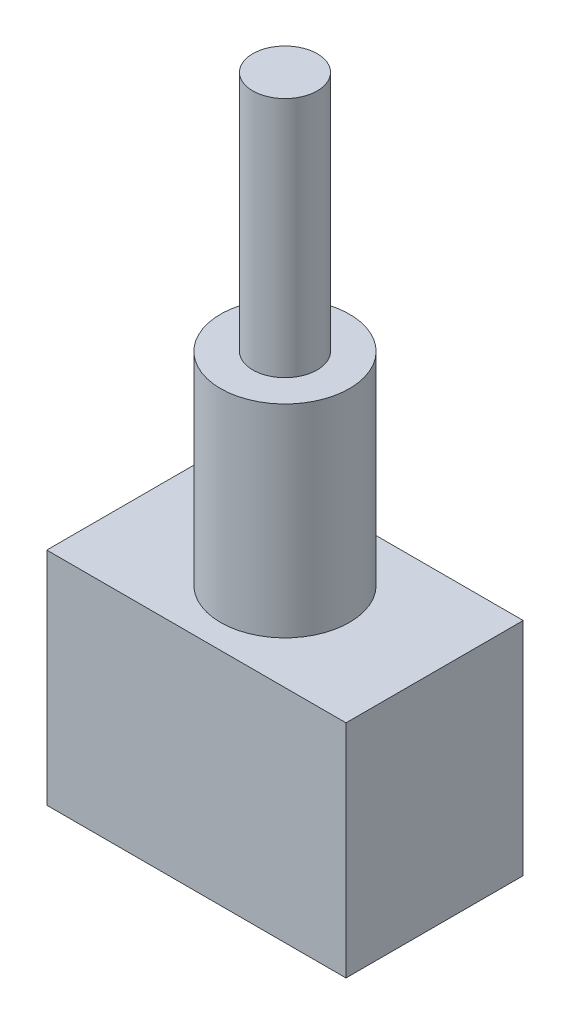
ISO-10303-21;
HEADER;
FILE_DESCRIPTION(('STEP AP214'),'2;1');
FILE_NAME('part.step','',(''),(''),'','','');
FILE_SCHEMA(('AUTOMOTIVE_DESIGN { 1 0 10303 214 1 1 1 1 }'));
ENDSEC;
DATA;
#1=APPLICATION_CONTEXT('core data for automotive mechanical design processes');
#2=APPLICATION_PROTOCOL_DEFINITION('international standard','automotive_design',2000,#1);
#3=PRODUCT_CONTEXT('',#1,'mechanical');
#4=PRODUCT('Part','Part','',(#3));
#5=PRODUCT_RELATED_PRODUCT_CATEGORY('part','',(#4));
#6=PRODUCT_DEFINITION_FORMATION('','',#4);
#7=PRODUCT_DEFINITION_CONTEXT('part definition',#1,'design');
#8=PRODUCT_DEFINITION('design','',#6,#7);
#9=PRODUCT_DEFINITION_SHAPE('','',#8);
#10=(LENGTH_UNIT() NAMED_UNIT(*) SI_UNIT(.MILLI.,.METRE.));
#11=(NAMED_UNIT(*) PLANE_ANGLE_UNIT() SI_UNIT($,.RADIAN.));
#12=(NAMED_UNIT(*) SI_UNIT($,.STERADIAN.) SOLID_ANGLE_UNIT());
#13=UNCERTAINTY_MEASURE_WITH_UNIT(LENGTH_MEASURE(1.E-05),#10,'distance_accuracy_value','');
#14=(GEOMETRIC_REPRESENTATION_CONTEXT(3) GLOBAL_UNCERTAINTY_ASSIGNED_CONTEXT((#13)) GLOBAL_UNIT_ASSIGNED_CONTEXT((#10,
#11,#12)) REPRESENTATION_CONTEXT('',''));
#15=CARTESIAN_POINT('',(0.,0.,0.));
#16=DIRECTION('',(0.,0.,1.));
#17=DIRECTION('',(1.,0.,0.));
#18=AXIS2_PLACEMENT_3D('',#15,#16,#17);
#19=CARTESIAN_POINT('',(0.,0.,7.7));
#20=DIRECTION('',(1.,0.,0.));
#21=DIRECTION('',(0.,0.,-1.));
#22=AXIS2_PLACEMENT_3D('',#19,#20,#21);
#23=PLANE('',#22);
#24=DIRECTION('',(0.,-1.,0.));
#25=VECTOR('',#24,1.);
#26=CARTESIAN_POINT('',(0.,0.,0.));
#27=LINE('',#26,#25);
#28=CARTESIAN_POINT('',(0.,9.6,0.));
#29=VERTEX_POINT('',#28);
#30=CARTESIAN_POINT('',(0.,0.,0.));
#31=VERTEX_POINT('',#30);
#32=EDGE_CURVE('E101',#29,#31,#27,.T.);
#33=ORIENTED_EDGE('',*,*,#32,.T.);
#34=DIRECTION('',(0.,0.,-1.));
#35=VECTOR('',#34,1.);
#36=CARTESIAN_POINT('',(0.,0.,7.7));
#37=LINE('',#36,#35);
#38=CARTESIAN_POINT('',(0.,0.,7.7));
#39=VERTEX_POINT('',#38);
#40=EDGE_CURVE('E37',#39,#31,#37,.T.);
#41=ORIENTED_EDGE('',*,*,#40,.F.);
#42=DIRECTION('',(0.,-1.,0.));
#43=VECTOR('',#42,1.);
#44=CARTESIAN_POINT('',(0.,0.,7.7));
#45=LINE('',#44,#43);
#46=CARTESIAN_POINT('',(0.,9.6,7.7));
#47=VERTEX_POINT('',#46);
#48=EDGE_CURVE('E88',#47,#39,#45,.T.);
#49=ORIENTED_EDGE('',*,*,#48,.F.);
#50=DIRECTION('',(0.,0.,-1.));
#51=VECTOR('',#50,1.);
#52=CARTESIAN_POINT('',(0.,9.6,7.7));
#53=LINE('',#52,#51);
#54=EDGE_CURVE('E97',#47,#29,#53,.T.);
#55=ORIENTED_EDGE('',*,*,#54,.T.);
#56=EDGE_LOOP('',(#33,#41,#49,#55));
#57=FACE_BOUND('',#56,.T.);
#58=ADVANCED_FACE('F34',(#57),#23,.F.);
#59=CARTESIAN_POINT('',(13.,0.,7.7));
#60=DIRECTION('',(0.,1.,0.));
#61=DIRECTION('',(-1.,0.,0.));
#62=AXIS2_PLACEMENT_3D('',#59,#60,#61);
#63=PLANE('',#62);
#64=DIRECTION('',(1.,0.,0.));
#65=VECTOR('',#64,1.);
#66=CARTESIAN_POINT('',(13.,0.,0.));
#67=LINE('',#66,#65);
#68=CARTESIAN_POINT('',(13.,0.,0.));
#69=VERTEX_POINT('',#68);
#70=EDGE_CURVE('E93',#31,#69,#67,.T.);
#71=ORIENTED_EDGE('',*,*,#70,.T.);
#72=DIRECTION('',(0.,0.,-1.));
#73=VECTOR('',#72,1.);
#74=CARTESIAN_POINT('',(13.,0.,7.7));
#75=LINE('',#74,#73);
#76=CARTESIAN_POINT('',(13.,0.,7.7));
#77=VERTEX_POINT('',#76);
#78=EDGE_CURVE('E91',#77,#69,#75,.T.);
#79=ORIENTED_EDGE('',*,*,#78,.F.);
#80=DIRECTION('',(1.,0.,0.));
#81=VECTOR('',#80,1.);
#82=CARTESIAN_POINT('',(13.,0.,7.7));
#83=LINE('',#82,#81);
#84=EDGE_CURVE('E83',#39,#77,#83,.T.);
#85=ORIENTED_EDGE('',*,*,#84,.F.);
#86=ORIENTED_EDGE('',*,*,#40,.T.);
#87=EDGE_LOOP('',(#71,#79,#85,#86));
#88=FACE_BOUND('',#87,.T.);
#89=ADVANCED_FACE('F92',(#88),#63,.F.);
#90=CARTESIAN_POINT('',(13.,9.6,7.7));
#91=DIRECTION('',(-1.,0.,0.));
#92=DIRECTION('',(0.,-1.,0.));
#93=AXIS2_PLACEMENT_3D('',#90,#91,#92);
#94=PLANE('',#93);
#95=DIRECTION('',(0.,1.,0.));
#96=VECTOR('',#95,1.);
#97=CARTESIAN_POINT('',(13.,9.6,0.));
#98=LINE('',#97,#96);
#99=CARTESIAN_POINT('',(13.,9.6,0.));
#100=VERTEX_POINT('',#99);
#101=EDGE_CURVE('E69',#69,#100,#98,.T.);
#102=ORIENTED_EDGE('',*,*,#101,.T.);
#103=DIRECTION('',(0.,0.,-1.));
#104=VECTOR('',#103,1.);
#105=CARTESIAN_POINT('',(13.,9.6,7.7));
#106=LINE('',#105,#104);
#107=CARTESIAN_POINT('',(13.,9.6,7.7));
#108=VERTEX_POINT('',#107);
#109=EDGE_CURVE('E94',#108,#100,#106,.T.);
#110=ORIENTED_EDGE('',*,*,#109,.F.);
#111=DIRECTION('',(0.,1.,0.));
#112=VECTOR('',#111,1.);
#113=CARTESIAN_POINT('',(13.,9.6,7.7));
#114=LINE('',#113,#112);
#115=EDGE_CURVE('E86',#77,#108,#114,.T.);
#116=ORIENTED_EDGE('',*,*,#115,.F.);
#117=ORIENTED_EDGE('',*,*,#78,.T.);
#118=EDGE_LOOP('',(#102,#110,#116,#117));
#119=FACE_BOUND('',#118,.T.);
#120=ADVANCED_FACE('F95',(#119),#94,.F.);
#121=CARTESIAN_POINT('',(0.,9.6,7.7));
#122=DIRECTION('',(0.,-1.,0.));
#123=DIRECTION('',(0.,0.,-1.));
#124=AXIS2_PLACEMENT_3D('',#121,#122,#123);
#125=PLANE('',#124);
#126=CARTESIAN_POINT('',(6.5,9.6,3.85));
#127=DIRECTION('',(0.,1.,0.));
#128=DIRECTION('',(0.,0.,1.));
#129=AXIS2_PLACEMENT_3D('',#126,#127,#128);
#130=CIRCLE('',#129,2.8);
#131=CARTESIAN_POINT('',(6.5,9.6,6.65));
#132=VERTEX_POINT('',#131);
#133=EDGE_CURVE('E43',#132,#132,#130,.T.);
#134=ORIENTED_EDGE('',*,*,#133,.F.);
#135=EDGE_LOOP('',(#134));
#136=FACE_BOUND('',#135,.T.);
#137=DIRECTION('',(-1.,0.,0.));
#138=VECTOR('',#137,1.);
#139=CARTESIAN_POINT('',(0.,9.6,0.));
#140=LINE('',#139,#138);
#141=EDGE_CURVE('E75',#100,#29,#140,.T.);
#142=ORIENTED_EDGE('',*,*,#141,.T.);
#143=ORIENTED_EDGE('',*,*,#54,.F.);
#144=DIRECTION('',(-1.,0.,0.));
#145=VECTOR('',#144,1.);
#146=CARTESIAN_POINT('',(0.,9.6,7.7));
#147=LINE('',#146,#145);
#148=EDGE_CURVE('E52',#108,#47,#147,.T.);
#149=ORIENTED_EDGE('',*,*,#148,.F.);
#150=ORIENTED_EDGE('',*,*,#109,.T.);
#151=EDGE_LOOP('',(#142,#143,#149,#150));
#152=FACE_BOUND('',#151,.T.);
#153=ADVANCED_FACE('F109',(#136,#152),#125,.F.);
#154=CARTESIAN_POINT('',(0.,0.,7.7));
#155=DIRECTION('',(0.,0.,-1.));
#156=DIRECTION('',(-1.,0.,0.));
#157=AXIS2_PLACEMENT_3D('',#154,#155,#156);
#158=PLANE('',#157);
#159=ORIENTED_EDGE('',*,*,#48,.T.);
#160=ORIENTED_EDGE('',*,*,#84,.T.);
#161=ORIENTED_EDGE('',*,*,#115,.T.);
#162=ORIENTED_EDGE('',*,*,#148,.T.);
#163=EDGE_LOOP('',(#159,#160,#161,#162));
#164=FACE_BOUND('',#163,.T.);
#165=ADVANCED_FACE('F84',(#164),#158,.F.);
#166=CARTESIAN_POINT('',(0.,0.,0.));
#167=DIRECTION('',(0.,0.,-1.));
#168=DIRECTION('',(-1.,0.,0.));
#169=AXIS2_PLACEMENT_3D('',#166,#167,#168);
#170=PLANE('',#169);
#171=ORIENTED_EDGE('',*,*,#32,.F.);
#172=ORIENTED_EDGE('',*,*,#141,.F.);
#173=ORIENTED_EDGE('',*,*,#101,.F.);
#174=ORIENTED_EDGE('',*,*,#70,.F.);
#175=EDGE_LOOP('',(#171,#172,#173,#174));
#176=FACE_BOUND('',#175,.T.);
#177=ADVANCED_FACE('F112',(#176),#170,.T.);
#178=CARTESIAN_POINT('',(6.5,18.4,3.85));
#179=DIRECTION('',(0.,-1.,0.));
#180=DIRECTION('',(0.,0.,-1.));
#181=AXIS2_PLACEMENT_3D('',#178,#179,#180);
#182=CYLINDRICAL_SURFACE('',#181,2.8);
#183=CARTESIAN_POINT('',(6.5,18.4,3.85));
#184=DIRECTION('',(0.,1.,0.));
#185=DIRECTION('',(0.,0.,1.));
#186=AXIS2_PLACEMENT_3D('',#183,#184,#185);
#187=CIRCLE('',#186,2.8);
#188=CARTESIAN_POINT('',(6.5,18.4,6.65));
#189=VERTEX_POINT('',#188);
#190=EDGE_CURVE('E104',#189,#189,#187,.T.);
#191=ORIENTED_EDGE('',*,*,#190,.F.);
#192=EDGE_LOOP('',(#191));
#193=FACE_BOUND('',#192,.T.);
#194=ORIENTED_EDGE('',*,*,#133,.T.);
#195=EDGE_LOOP('',(#194));
#196=FACE_BOUND('',#195,.T.);
#197=ADVANCED_FACE('F134',(#193,#196),#182,.T.);
#198=CARTESIAN_POINT('',(6.5,18.4,3.85));
#199=DIRECTION('',(0.,1.,0.));
#200=DIRECTION('',(0.,0.,1.));
#201=AXIS2_PLACEMENT_3D('',#198,#199,#200);
#202=PLANE('',#201);
#203=CARTESIAN_POINT('',(6.5,18.4,3.85));
#204=DIRECTION('',(0.,1.,0.));
#205=DIRECTION('',(0.,0.,1.));
#206=AXIS2_PLACEMENT_3D('',#203,#204,#205);
#207=CIRCLE('',#206,1.4);
#208=CARTESIAN_POINT('',(6.5,18.4,2.45));
#209=VERTEX_POINT('',#208);
#210=EDGE_CURVE('E11',#209,#209,#207,.T.);
#211=ORIENTED_EDGE('',*,*,#210,.F.);
#212=EDGE_LOOP('',(#211));
#213=FACE_BOUND('',#212,.T.);
#214=ORIENTED_EDGE('',*,*,#190,.T.);
#215=EDGE_LOOP('',(#214));
#216=FACE_BOUND('',#215,.T.);
#217=ADVANCED_FACE('F128',(#213,#216),#202,.T.);
#218=CARTESIAN_POINT('',(6.5,28.9,3.85));
#219=DIRECTION('',(0.,-1.,0.));
#220=DIRECTION('',(0.,0.,-1.));
#221=AXIS2_PLACEMENT_3D('',#218,#219,#220);
#222=CYLINDRICAL_SURFACE('',#221,1.4);
#223=CARTESIAN_POINT('',(6.5,28.9,3.85));
#224=DIRECTION('',(0.,1.,0.));
#225=DIRECTION('',(0.,0.,1.));
#226=AXIS2_PLACEMENT_3D('',#223,#224,#225);
#227=CIRCLE('',#226,1.4);
#228=CARTESIAN_POINT('',(6.5,28.9,2.45));
#229=VERTEX_POINT('',#228);
#230=EDGE_CURVE('E118',#229,#229,#227,.T.);
#231=CARTESIAN_POINT('',(6.5,28.9,2.45));
#232=CARTESIAN_POINT('',(6.5,28.790625,2.45));
#233=CARTESIAN_POINT('',(6.5,28.68125,2.45));
#234=CARTESIAN_POINT('',(6.5,28.4625,2.45));
#235=CARTESIAN_POINT('',(6.5,28.353125,2.45));
#236=CARTESIAN_POINT('',(6.5,28.134375,2.45));
#237=CARTESIAN_POINT('',(6.5,28.025,2.45));
#238=CARTESIAN_POINT('',(6.5,27.80625,2.45));
#239=CARTESIAN_POINT('',(6.5,27.696875,2.45));
#240=CARTESIAN_POINT('',(6.5,27.478125,2.45));
#241=CARTESIAN_POINT('',(6.5,27.36875,2.45));
#242=CARTESIAN_POINT('',(6.5,27.15,2.45));
#243=CARTESIAN_POINT('',(6.5,27.040625,2.45));
#244=CARTESIAN_POINT('',(6.5,26.821875,2.45));
#245=CARTESIAN_POINT('',(6.5,26.7125,2.45));
#246=CARTESIAN_POINT('',(6.5,26.49375,2.45));
#247=CARTESIAN_POINT('',(6.5,26.384375,2.45));
#248=CARTESIAN_POINT('',(6.5,26.165625,2.45));
#249=CARTESIAN_POINT('',(6.5,26.05625,2.45));
#250=CARTESIAN_POINT('',(6.5,25.8375,2.45));
#251=CARTESIAN_POINT('',(6.5,25.728125,2.45));
#252=CARTESIAN_POINT('',(6.5,25.509375,2.45));
#253=CARTESIAN_POINT('',(6.5,25.4,2.45));
#254=CARTESIAN_POINT('',(6.5,25.18125,2.45));
#255=CARTESIAN_POINT('',(6.5,25.071875,2.45));
#256=CARTESIAN_POINT('',(6.5,24.853125,2.45));
#257=CARTESIAN_POINT('',(6.5,24.74375,2.45));
#258=CARTESIAN_POINT('',(6.5,24.525,2.45));
#259=CARTESIAN_POINT('',(6.5,24.415625,2.45));
#260=CARTESIAN_POINT('',(6.5,24.196875,2.45));
#261=CARTESIAN_POINT('',(6.5,24.0875,2.45));
#262=CARTESIAN_POINT('',(6.5,23.86875,2.45));
#263=CARTESIAN_POINT('',(6.5,23.759375,2.45));
#264=CARTESIAN_POINT('',(6.5,23.540625,2.45));
#265=CARTESIAN_POINT('',(6.5,23.43125,2.45));
#266=CARTESIAN_POINT('',(6.5,23.2125,2.45));
#267=CARTESIAN_POINT('',(6.5,23.103125,2.45));
#268=CARTESIAN_POINT('',(6.5,22.884375,2.45));
#269=CARTESIAN_POINT('',(6.5,22.775,2.45));
#270=CARTESIAN_POINT('',(6.5,22.55625,2.45));
#271=CARTESIAN_POINT('',(6.5,22.446875,2.45));
#272=CARTESIAN_POINT('',(6.5,22.228125,2.45));
#273=CARTESIAN_POINT('',(6.5,22.11875,2.45));
#274=CARTESIAN_POINT('',(6.5,21.9,2.45));
#275=CARTESIAN_POINT('',(6.5,21.790625,2.45));
#276=CARTESIAN_POINT('',(6.5,21.571875,2.45));
#277=CARTESIAN_POINT('',(6.5,21.4625,2.45));
#278=CARTESIAN_POINT('',(6.5,21.24375,2.45));
#279=CARTESIAN_POINT('',(6.5,21.134375,2.45));
#280=CARTESIAN_POINT('',(6.5,20.915625,2.45));
#281=CARTESIAN_POINT('',(6.5,20.80625,2.45));
#282=CARTESIAN_POINT('',(6.5,20.5875,2.45));
#283=CARTESIAN_POINT('',(6.5,20.478125,2.45));
#284=CARTESIAN_POINT('',(6.5,20.259375,2.45));
#285=CARTESIAN_POINT('',(6.5,20.15,2.45));
#286=CARTESIAN_POINT('',(6.5,19.93125,2.45));
#287=CARTESIAN_POINT('',(6.5,19.821875,2.45));
#288=CARTESIAN_POINT('',(6.5,19.603125,2.45));
#289=CARTESIAN_POINT('',(6.5,19.49375,2.45));
#290=CARTESIAN_POINT('',(6.5,19.275,2.45));
#291=CARTESIAN_POINT('',(6.5,19.165625,2.45));
#292=CARTESIAN_POINT('',(6.5,18.946875,2.45));
#293=CARTESIAN_POINT('',(6.5,18.8375,2.45));
#294=CARTESIAN_POINT('',(6.5,18.61875,2.45));
#295=CARTESIAN_POINT('',(6.5,18.509375,2.45));
#296=CARTESIAN_POINT('',(6.5,18.4,2.45));
#297=B_SPLINE_CURVE_WITH_KNOTS('',3,(#231,#232,#233,#234,#235,#236,#237,#238,#239,#240,#241,
#242,#243,#244,#245,#246,#247,#248,#249,#250,#251,#252,#253,#254,#255,#256,#257,#258,#259,#260,
#261,#262,#263,#264,#265,#266,#267,#268,#269,#270,#271,#272,#273,#274,#275,#276,#277,#278,#279,
#280,#281,#282,#283,#284,#285,#286,#287,#288,#289,#290,#291,#292,#293,#294,#295,#296),
.UNSPECIFIED.,.F.,.F.,(4,2,2,2,2,2,2,2,2,2,2,2,2,2,2,2,2,2,2,2,2,2,2,2,2,2,2,2,2,2,2,2,4),(0.,
0.328125000000002,0.656250000000001,0.984375000000003,1.3125,1.640625,1.96875,2.296875,2.625,
2.953125,3.28125,3.609375,3.9375,4.265625,4.59375,4.921875,5.25,5.578125,5.90625,6.234375,
6.5625,6.890625,7.21875,7.54687500000001,7.875,8.20312500000001,8.53125,8.859375,9.1875,
9.515625,9.84375000000001,10.171875,10.5),.UNSPECIFIED.);
#298=EDGE_CURVE('BSEAM125',#229,#209,#297,.T.);
#299=ORIENTED_EDGE('',*,*,#230,.F.);
#300=ORIENTED_EDGE('',*,*,#210,.T.);
#301=ORIENTED_EDGE('',*,*,#298,.T.);
#302=ORIENTED_EDGE('',*,*,#298,.F.);
#303=EDGE_LOOP('',(#299,#301,#300,#302));
#304=FACE_BOUND('',#303,.T.);
#305=ADVANCED_FACE('F125',(#304),#222,.T.);
#306=CARTESIAN_POINT('',(6.5,28.9,3.85));
#307=DIRECTION('',(0.,1.,0.));
#308=DIRECTION('',(0.,0.,1.));
#309=AXIS2_PLACEMENT_3D('',#306,#307,#308);
#310=PLANE('',#309);
#311=ORIENTED_EDGE('',*,*,#230,.T.);
#312=EDGE_LOOP('',(#311));
#313=FACE_BOUND('',#312,.T.);
#314=ADVANCED_FACE('F123',(#313),#310,.T.);
#315=CLOSED_SHELL('',(#58,#89,#120,#153,#165,#177,#197,#217,#305,#314));
#316=MANIFOLD_SOLID_BREP('B2',#315);
#317=ADVANCED_BREP_SHAPE_REPRESENTATION('',(#18,#316),#14);
#318=SHAPE_DEFINITION_REPRESENTATION(#9,#317);
ENDSEC;
END-ISO-10303-21;
